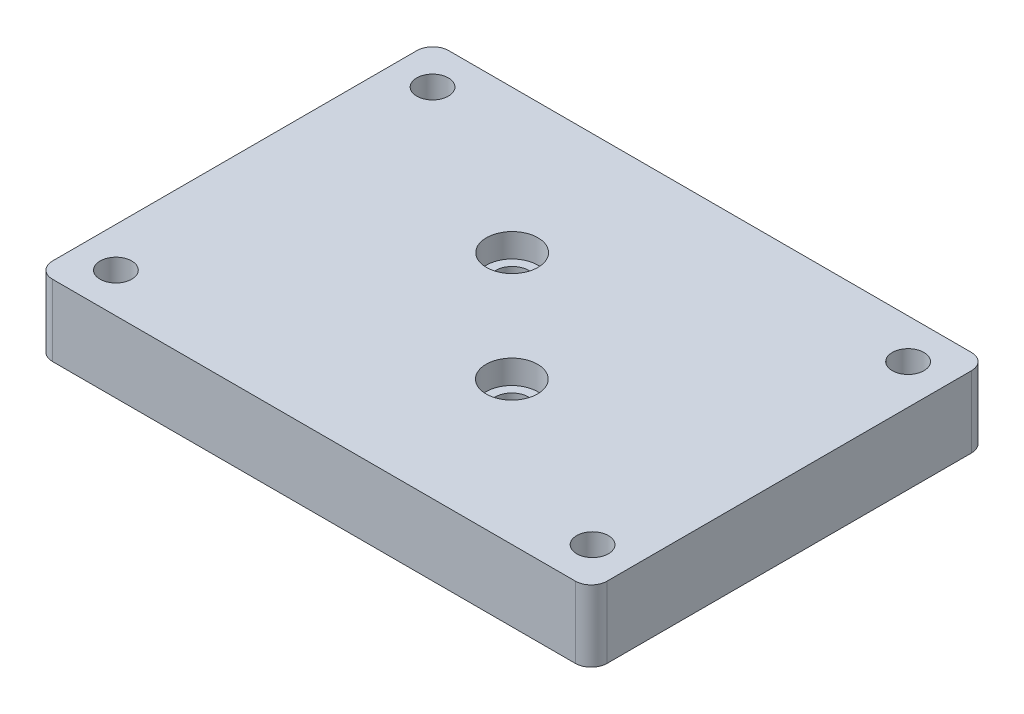
ISO-10303-21;
HEADER;
FILE_DESCRIPTION(('STEP AP214'),'2;1');
FILE_NAME('part.step','',(''),(''),'','','');
FILE_SCHEMA(('AUTOMOTIVE_DESIGN { 1 0 10303 214 1 1 1 1 }'));
ENDSEC;
DATA;
#1=APPLICATION_CONTEXT('core data for automotive mechanical design processes');
#2=APPLICATION_PROTOCOL_DEFINITION('international standard','automotive_design',2000,#1);
#3=PRODUCT_CONTEXT('',#1,'mechanical');
#4=PRODUCT('Part','Part','',(#3));
#5=PRODUCT_RELATED_PRODUCT_CATEGORY('part','',(#4));
#6=PRODUCT_DEFINITION_FORMATION('','',#4);
#7=PRODUCT_DEFINITION_CONTEXT('part definition',#1,'design');
#8=PRODUCT_DEFINITION('design','',#6,#7);
#9=PRODUCT_DEFINITION_SHAPE('','',#8);
#10=(LENGTH_UNIT() NAMED_UNIT(*) SI_UNIT(.MILLI.,.METRE.));
#11=(NAMED_UNIT(*) PLANE_ANGLE_UNIT() SI_UNIT($,.RADIAN.));
#12=(NAMED_UNIT(*) SI_UNIT($,.STERADIAN.) SOLID_ANGLE_UNIT());
#13=UNCERTAINTY_MEASURE_WITH_UNIT(LENGTH_MEASURE(1.E-05),#10,'distance_accuracy_value','');
#14=(GEOMETRIC_REPRESENTATION_CONTEXT(3) GLOBAL_UNCERTAINTY_ASSIGNED_CONTEXT((#13)) GLOBAL_UNIT_ASSIGNED_CONTEXT((#10,
#11,#12)) REPRESENTATION_CONTEXT('',''));
#15=CARTESIAN_POINT('',(0.,0.,0.));
#16=DIRECTION('',(0.,0.,1.));
#17=DIRECTION('',(1.,0.,0.));
#18=AXIS2_PLACEMENT_3D('',#15,#16,#17);
#19=CARTESIAN_POINT('',(-28.500824125447,9.,-0.102965199523085));
#20=DIRECTION('',(0.,-1.,0.));
#21=DIRECTION('',(0.,0.,-1.));
#22=AXIS2_PLACEMENT_3D('',#19,#20,#21);
#23=CYLINDRICAL_SURFACE('',#22,6.50000000000001);
#24=CARTESIAN_POINT('',(-28.500824125447,0.,-0.102965199523085));
#25=DIRECTION('',(0.,1.,0.));
#26=DIRECTION('',(0.,0.,1.));
#27=AXIS2_PLACEMENT_3D('',#24,#25,#26);
#28=CIRCLE('',#27,6.50000000000001);
#29=CARTESIAN_POINT('',(-28.500824125447,0.,6.39703480047692));
#30=VERTEX_POINT('',#29);
#31=EDGE_CURVE('E173',#30,#30,#28,.T.);
#32=ORIENTED_EDGE('',*,*,#31,.F.);
#33=EDGE_LOOP('',(#32));
#34=FACE_BOUND('',#33,.T.);
#35=CARTESIAN_POINT('',(-28.500824125447,4.5,-0.102965199523085));
#36=DIRECTION('',(0.,1.,0.));
#37=DIRECTION('',(0.,0.,1.));
#38=AXIS2_PLACEMENT_3D('',#35,#36,#37);
#39=CIRCLE('',#38,6.5);
#40=CARTESIAN_POINT('',(-28.500824125447,4.5,6.39703480047692));
#41=VERTEX_POINT('',#40);
#42=EDGE_CURVE('E209',#41,#41,#39,.T.);
#43=ORIENTED_EDGE('',*,*,#42,.T.);
#44=EDGE_LOOP('',(#43));
#45=FACE_BOUND('',#44,.T.);
#46=ADVANCED_FACE('F37',(#34,#45),#23,.F.);
#47=CARTESIAN_POINT('',(-21.595316651252,0.,6.82252153599509));
#48=DIRECTION('',(0.,1.,0.));
#49=DIRECTION('',(0.,0.,1.));
#50=AXIS2_PLACEMENT_3D('',#47,#48,#49);
#51=CYLINDRICAL_SURFACE('',#50,2.1);
#52=CARTESIAN_POINT('',(-21.595316651252,0.,6.82252153599509));
#53=DIRECTION('',(0.,1.,0.));
#54=DIRECTION('',(0.,0.,1.));
#55=AXIS2_PLACEMENT_3D('',#52,#53,#54);
#56=CIRCLE('',#55,2.1);
#57=CARTESIAN_POINT('',(-21.595316651252,0.,8.92252153599509));
#58=VERTEX_POINT('',#57);
#59=EDGE_CURVE('E199',#58,#58,#56,.T.);
#60=ORIENTED_EDGE('',*,*,#59,.F.);
#61=EDGE_LOOP('',(#60));
#62=FACE_BOUND('',#61,.T.);
#63=CARTESIAN_POINT('',(-21.595316651252,6.,6.82252153599509));
#64=DIRECTION('',(0.,1.,0.));
#65=DIRECTION('',(0.,0.,1.));
#66=AXIS2_PLACEMENT_3D('',#63,#64,#65);
#67=CIRCLE('',#66,2.1);
#68=CARTESIAN_POINT('',(-21.595316651252,6.,8.92252153599509));
#69=VERTEX_POINT('',#68);
#70=EDGE_CURVE('E137',#69,#69,#67,.F.);
#71=ORIENTED_EDGE('',*,*,#70,.F.);
#72=EDGE_LOOP('',(#71));
#73=FACE_BOUND('',#72,.T.);
#74=ADVANCED_FACE('F260',(#62,#73),#51,.F.);
#75=CARTESIAN_POINT('',(-35.4063315996419,0.,-7.02845193504126));
#76=DIRECTION('',(0.,1.,0.));
#77=DIRECTION('',(0.,0.,1.));
#78=AXIS2_PLACEMENT_3D('',#75,#76,#77);
#79=CYLINDRICAL_SURFACE('',#78,2.1);
#80=CARTESIAN_POINT('',(-35.4063315996419,0.,-7.02845193504126));
#81=DIRECTION('',(0.,1.,0.));
#82=DIRECTION('',(0.,0.,1.));
#83=AXIS2_PLACEMENT_3D('',#80,#81,#82);
#84=CIRCLE('',#83,2.1);
#85=CARTESIAN_POINT('',(-35.4063315996419,0.,-4.92845193504126));
#86=VERTEX_POINT('',#85);
#87=EDGE_CURVE('E177',#86,#86,#84,.T.);
#88=ORIENTED_EDGE('',*,*,#87,.F.);
#89=EDGE_LOOP('',(#88));
#90=FACE_BOUND('',#89,.T.);
#91=CARTESIAN_POINT('',(-35.4063315996419,6.,-7.02845193504126));
#92=DIRECTION('',(0.,1.,0.));
#93=DIRECTION('',(0.,0.,1.));
#94=AXIS2_PLACEMENT_3D('',#91,#92,#93);
#95=CIRCLE('',#94,2.1);
#96=CARTESIAN_POINT('',(-35.4063315996419,6.,-4.92845193504126));
#97=VERTEX_POINT('',#96);
#98=EDGE_CURVE('E193',#97,#97,#95,.F.);
#99=ORIENTED_EDGE('',*,*,#98,.F.);
#100=EDGE_LOOP('',(#99));
#101=FACE_BOUND('',#100,.T.);
#102=ADVANCED_FACE('F266',(#90,#101),#79,.F.);
#103=CARTESIAN_POINT('',(0.,9.,-25.1029651995231));
#104=DIRECTION('',(0.,0.,1.));
#105=DIRECTION('',(1.,0.,0.));
#106=AXIS2_PLACEMENT_3D('',#103,#104,#105);
#107=PLANE('',#106);
#108=DIRECTION('',(-1.,0.,0.));
#109=VECTOR('',#108,1.);
#110=CARTESIAN_POINT('',(0.,9.,-25.1029651995231));
#111=LINE('',#110,#109);
#112=CARTESIAN_POINT('',(4.49917587455304,9.,-25.1029651995231));
#113=VERTEX_POINT('',#112);
#114=CARTESIAN_POINT('',(-61.500824125447,9.,-25.1029651995231));
#115=VERTEX_POINT('',#114);
#116=EDGE_CURVE('E161',#113,#115,#111,.T.);
#117=ORIENTED_EDGE('',*,*,#116,.F.);
#118=DIRECTION('',(0.,-1.,0.));
#119=VECTOR('',#118,1.);
#120=CARTESIAN_POINT('',(4.49917587455304,0.,-25.1029651995231));
#121=LINE('',#120,#119);
#122=CARTESIAN_POINT('',(4.49917587455304,0.,-25.1029651995231));
#123=VERTEX_POINT('',#122);
#124=EDGE_CURVE('E156',#113,#123,#121,.T.);
#125=ORIENTED_EDGE('',*,*,#124,.T.);
#126=DIRECTION('',(-1.,0.,0.));
#127=VECTOR('',#126,1.);
#128=CARTESIAN_POINT('',(0.,0.,-25.1029651995231));
#129=LINE('',#128,#127);
#130=CARTESIAN_POINT('',(-61.500824125447,0.,-25.1029651995231));
#131=VERTEX_POINT('',#130);
#132=EDGE_CURVE('E108',#123,#131,#129,.T.);
#133=ORIENTED_EDGE('',*,*,#132,.T.);
#134=DIRECTION('',(0.,-1.,0.));
#135=VECTOR('',#134,1.);
#136=CARTESIAN_POINT('',(-61.500824125447,9.,-25.1029651995231));
#137=LINE('',#136,#135);
#138=EDGE_CURVE('E154',#131,#115,#137,.F.);
#139=ORIENTED_EDGE('',*,*,#138,.T.);
#140=EDGE_LOOP('',(#117,#125,#133,#139));
#141=FACE_BOUND('',#140,.T.);
#142=ADVANCED_FACE('F159',(#141),#107,.F.);
#143=CARTESIAN_POINT('',(-63.500824125447,9.,0.));
#144=DIRECTION('',(1.,0.,0.));
#145=DIRECTION('',(0.,0.,-1.));
#146=AXIS2_PLACEMENT_3D('',#143,#144,#145);
#147=PLANE('',#146);
#148=DIRECTION('',(0.,0.,1.));
#149=VECTOR('',#148,1.);
#150=CARTESIAN_POINT('',(-63.500824125447,9.,0.));
#151=LINE('',#150,#149);
#152=CARTESIAN_POINT('',(-63.500824125447,9.,-23.1029651995231));
#153=VERTEX_POINT('',#152);
#154=CARTESIAN_POINT('',(-63.500824125447,9.,22.8970348004769));
#155=VERTEX_POINT('',#154);
#156=EDGE_CURVE('E162',#153,#155,#151,.T.);
#157=ORIENTED_EDGE('',*,*,#156,.F.);
#158=DIRECTION('',(0.,-1.,0.));
#159=VECTOR('',#158,1.);
#160=CARTESIAN_POINT('',(-63.500824125447,9.,-23.1029651995231));
#161=LINE('',#160,#159);
#162=CARTESIAN_POINT('',(-63.500824125447,0.,-23.1029651995231));
#163=VERTEX_POINT('',#162);
#164=EDGE_CURVE('E11',#153,#163,#161,.T.);
#165=ORIENTED_EDGE('',*,*,#164,.T.);
#166=DIRECTION('',(0.,0.,1.));
#167=VECTOR('',#166,1.);
#168=CARTESIAN_POINT('',(-63.500824125447,0.,0.));
#169=LINE('',#168,#167);
#170=CARTESIAN_POINT('',(-63.500824125447,0.,22.8970348004769));
#171=VERTEX_POINT('',#170);
#172=EDGE_CURVE('E190',#163,#171,#169,.T.);
#173=ORIENTED_EDGE('',*,*,#172,.T.);
#174=DIRECTION('',(0.,-1.,0.));
#175=VECTOR('',#174,1.);
#176=CARTESIAN_POINT('',(-63.500824125447,9.,22.8970348004769));
#177=LINE('',#176,#175);
#178=EDGE_CURVE('E45',#171,#155,#177,.F.);
#179=ORIENTED_EDGE('',*,*,#178,.T.);
#180=EDGE_LOOP('',(#157,#165,#173,#179));
#181=FACE_BOUND('',#180,.T.);
#182=ADVANCED_FACE('F248',(#181),#147,.F.);
#183=CARTESIAN_POINT('',(0.,9.,24.8970348004769));
#184=DIRECTION('',(0.,0.,1.));
#185=DIRECTION('',(1.,0.,0.));
#186=AXIS2_PLACEMENT_3D('',#183,#184,#185);
#187=PLANE('',#186);
#188=DIRECTION('',(-1.,0.,0.));
#189=VECTOR('',#188,1.);
#190=CARTESIAN_POINT('',(0.,0.,24.8970348004769));
#191=LINE('',#190,#189);
#192=CARTESIAN_POINT('',(4.49917587455305,0.,24.8970348004769));
#193=VERTEX_POINT('',#192);
#194=CARTESIAN_POINT('',(-61.500824125447,0.,24.8970348004769));
#195=VERTEX_POINT('',#194);
#196=EDGE_CURVE('E125',#193,#195,#191,.T.);
#197=ORIENTED_EDGE('',*,*,#196,.F.);
#198=DIRECTION('',(0.,-1.,0.));
#199=VECTOR('',#198,1.);
#200=CARTESIAN_POINT('',(4.49917587455305,9.,24.8970348004769));
#201=LINE('',#200,#199);
#202=CARTESIAN_POINT('',(4.49917587455305,9.,24.8970348004769));
#203=VERTEX_POINT('',#202);
#204=EDGE_CURVE('E146',#193,#203,#201,.F.);
#205=ORIENTED_EDGE('',*,*,#204,.T.);
#206=DIRECTION('',(-1.,0.,0.));
#207=VECTOR('',#206,1.);
#208=CARTESIAN_POINT('',(0.,9.,24.8970348004769));
#209=LINE('',#208,#207);
#210=CARTESIAN_POINT('',(-61.500824125447,9.,24.8970348004769));
#211=VERTEX_POINT('',#210);
#212=EDGE_CURVE('E134',#203,#211,#209,.T.);
#213=ORIENTED_EDGE('',*,*,#212,.T.);
#214=DIRECTION('',(0.,-1.,0.));
#215=VECTOR('',#214,1.);
#216=CARTESIAN_POINT('',(-61.500824125447,0.,24.8970348004769));
#217=LINE('',#216,#215);
#218=EDGE_CURVE('E143',#211,#195,#217,.T.);
#219=ORIENTED_EDGE('',*,*,#218,.T.);
#220=EDGE_LOOP('',(#197,#205,#213,#219));
#221=FACE_BOUND('',#220,.T.);
#222=ADVANCED_FACE('F245',(#221),#187,.T.);
#223=CARTESIAN_POINT('',(-58.5287751823824,9.,-20.1029651995231));
#224=DIRECTION('',(0.,-1.,0.));
#225=DIRECTION('',(0.,0.,-1.));
#226=AXIS2_PLACEMENT_3D('',#223,#224,#225);
#227=CYLINDRICAL_SURFACE('',#226,2.);
#228=CARTESIAN_POINT('',(-58.5287751823824,9.,-20.1029651995231));
#229=DIRECTION('',(0.,1.,0.));
#230=DIRECTION('',(0.,0.,1.));
#231=AXIS2_PLACEMENT_3D('',#228,#229,#230);
#232=CIRCLE('',#231,2.);
#233=CARTESIAN_POINT('',(-58.5287751823824,9.,-18.1029651995231));
#234=VERTEX_POINT('',#233);
#235=EDGE_CURVE('E163',#234,#234,#232,.T.);
#236=ORIENTED_EDGE('',*,*,#235,.T.);
#237=EDGE_LOOP('',(#236));
#238=FACE_BOUND('',#237,.T.);
#239=CARTESIAN_POINT('',(-58.5287751823824,0.,-20.1029651995231));
#240=DIRECTION('',(0.,1.,0.));
#241=DIRECTION('',(0.,0.,1.));
#242=AXIS2_PLACEMENT_3D('',#239,#240,#241);
#243=CIRCLE('',#242,2.);
#244=CARTESIAN_POINT('',(-58.5287751823824,0.,-18.1029651995231));
#245=VERTEX_POINT('',#244);
#246=EDGE_CURVE('E186',#245,#245,#243,.T.);
#247=ORIENTED_EDGE('',*,*,#246,.F.);
#248=EDGE_LOOP('',(#247));
#249=FACE_BOUND('',#248,.T.);
#250=ADVANCED_FACE('F304',(#238,#249),#227,.F.);
#251=CARTESIAN_POINT('',(-58.500824125447,9.,19.8970348004769));
#252=DIRECTION('',(0.,-1.,0.));
#253=DIRECTION('',(0.,0.,-1.));
#254=AXIS2_PLACEMENT_3D('',#251,#252,#253);
#255=CYLINDRICAL_SURFACE('',#254,2.);
#256=CARTESIAN_POINT('',(-58.500824125447,9.,19.8970348004769));
#257=DIRECTION('',(0.,1.,0.));
#258=DIRECTION('',(0.,0.,1.));
#259=AXIS2_PLACEMENT_3D('',#256,#257,#258);
#260=CIRCLE('',#259,2.);
#261=CARTESIAN_POINT('',(-58.500824125447,9.,21.8970348004769));
#262=VERTEX_POINT('',#261);
#263=EDGE_CURVE('E167',#262,#262,#260,.T.);
#264=ORIENTED_EDGE('',*,*,#263,.T.);
#265=EDGE_LOOP('',(#264));
#266=FACE_BOUND('',#265,.T.);
#267=CARTESIAN_POINT('',(-58.500824125447,0.,19.8970348004769));
#268=DIRECTION('',(0.,1.,0.));
#269=DIRECTION('',(0.,0.,1.));
#270=AXIS2_PLACEMENT_3D('',#267,#268,#269);
#271=CIRCLE('',#270,2.);
#272=CARTESIAN_POINT('',(-58.500824125447,0.,21.8970348004769));
#273=VERTEX_POINT('',#272);
#274=EDGE_CURVE('E183',#273,#273,#271,.T.);
#275=ORIENTED_EDGE('',*,*,#274,.F.);
#276=EDGE_LOOP('',(#275));
#277=FACE_BOUND('',#276,.T.);
#278=ADVANCED_FACE('F227',(#266,#277),#255,.F.);
#279=CARTESIAN_POINT('',(1.60014213614768,9.,19.8302312802415));
#280=DIRECTION('',(0.,-1.,0.));
#281=DIRECTION('',(0.,0.,-1.));
#282=AXIS2_PLACEMENT_3D('',#279,#280,#281);
#283=CYLINDRICAL_SURFACE('',#282,2.);
#284=CARTESIAN_POINT('',(1.60014213614768,9.,19.8302312802415));
#285=DIRECTION('',(0.,1.,0.));
#286=DIRECTION('',(0.,0.,1.));
#287=AXIS2_PLACEMENT_3D('',#284,#285,#286);
#288=CIRCLE('',#287,2.);
#289=CARTESIAN_POINT('',(1.60014213614768,9.,21.8302312802415));
#290=VERTEX_POINT('',#289);
#291=EDGE_CURVE('E222',#290,#290,#288,.T.);
#292=ORIENTED_EDGE('',*,*,#291,.T.);
#293=EDGE_LOOP('',(#292));
#294=FACE_BOUND('',#293,.T.);
#295=CARTESIAN_POINT('',(1.60014213614768,0.,19.8302312802415));
#296=DIRECTION('',(0.,1.,0.));
#297=DIRECTION('',(0.,0.,1.));
#298=AXIS2_PLACEMENT_3D('',#295,#296,#297);
#299=CIRCLE('',#298,2.);
#300=CARTESIAN_POINT('',(1.60014213614768,0.,21.8302312802415));
#301=VERTEX_POINT('',#300);
#302=EDGE_CURVE('E180',#301,#301,#299,.T.);
#303=ORIENTED_EDGE('',*,*,#302,.F.);
#304=EDGE_LOOP('',(#303));
#305=FACE_BOUND('',#304,.T.);
#306=ADVANCED_FACE('F313',(#294,#305),#283,.F.);
#307=CARTESIAN_POINT('',(1.49917587455305,9.,-20.1029651995231));
#308=DIRECTION('',(0.,-1.,0.));
#309=DIRECTION('',(0.,0.,-1.));
#310=AXIS2_PLACEMENT_3D('',#307,#308,#309);
#311=CYLINDRICAL_SURFACE('',#310,2.);
#312=CARTESIAN_POINT('',(1.49917587455305,9.,-20.1029651995231));
#313=DIRECTION('',(0.,1.,0.));
#314=DIRECTION('',(0.,0.,1.));
#315=AXIS2_PLACEMENT_3D('',#312,#313,#314);
#316=CIRCLE('',#315,2.);
#317=CARTESIAN_POINT('',(1.49917587455305,9.,-18.1029651995231));
#318=VERTEX_POINT('',#317);
#319=EDGE_CURVE('E124',#318,#318,#316,.T.);
#320=ORIENTED_EDGE('',*,*,#319,.T.);
#321=EDGE_LOOP('',(#320));
#322=FACE_BOUND('',#321,.T.);
#323=CARTESIAN_POINT('',(1.49917587455305,0.,-20.1029651995231));
#324=DIRECTION('',(0.,1.,0.));
#325=DIRECTION('',(0.,0.,1.));
#326=AXIS2_PLACEMENT_3D('',#323,#324,#325);
#327=CIRCLE('',#326,2.);
#328=CARTESIAN_POINT('',(1.49917587455305,0.,-18.1029651995231));
#329=VERTEX_POINT('',#328);
#330=EDGE_CURVE('E176',#329,#329,#327,.T.);
#331=ORIENTED_EDGE('',*,*,#330,.F.);
#332=EDGE_LOOP('',(#331));
#333=FACE_BOUND('',#332,.T.);
#334=ADVANCED_FACE('F273',(#322,#333),#311,.F.);
#335=CARTESIAN_POINT('',(6.49917587455305,9.,0.));
#336=DIRECTION('',(1.,0.,0.));
#337=DIRECTION('',(0.,0.,-1.));
#338=AXIS2_PLACEMENT_3D('',#335,#336,#337);
#339=PLANE('',#338);
#340=DIRECTION('',(0.,0.,1.));
#341=VECTOR('',#340,1.);
#342=CARTESIAN_POINT('',(6.49917587455305,9.,0.));
#343=LINE('',#342,#341);
#344=CARTESIAN_POINT('',(6.49917587455305,9.,-23.1029651995231));
#345=VERTEX_POINT('',#344);
#346=CARTESIAN_POINT('',(6.49917587455305,9.,22.8970348004769));
#347=VERTEX_POINT('',#346);
#348=EDGE_CURVE('E130',#345,#347,#343,.T.);
#349=ORIENTED_EDGE('',*,*,#348,.T.);
#350=DIRECTION('',(0.,-1.,0.));
#351=VECTOR('',#350,1.);
#352=CARTESIAN_POINT('',(6.49917587455305,9.,22.8970348004769));
#353=LINE('',#352,#351);
#354=CARTESIAN_POINT('',(6.49917587455305,0.,22.8970348004769));
#355=VERTEX_POINT('',#354);
#356=EDGE_CURVE('E123',#347,#355,#353,.T.);
#357=ORIENTED_EDGE('',*,*,#356,.T.);
#358=DIRECTION('',(0.,0.,1.));
#359=VECTOR('',#358,1.);
#360=CARTESIAN_POINT('',(6.49917587455305,0.,0.));
#361=LINE('',#360,#359);
#362=CARTESIAN_POINT('',(6.49917587455305,0.,-23.1029651995231));
#363=VERTEX_POINT('',#362);
#364=EDGE_CURVE('E106',#363,#355,#361,.T.);
#365=ORIENTED_EDGE('',*,*,#364,.F.);
#366=DIRECTION('',(0.,-1.,0.));
#367=VECTOR('',#366,1.);
#368=CARTESIAN_POINT('',(6.49917587455305,9.,-23.1029651995231));
#369=LINE('',#368,#367);
#370=EDGE_CURVE('E120',#363,#345,#369,.F.);
#371=ORIENTED_EDGE('',*,*,#370,.T.);
#372=EDGE_LOOP('',(#349,#357,#365,#371));
#373=FACE_BOUND('',#372,.T.);
#374=ADVANCED_FACE('F119',(#373),#339,.T.);
#375=CARTESIAN_POINT('',(0.,9.,0.));
#376=DIRECTION('',(0.,1.,0.));
#377=DIRECTION('',(0.,0.,1.));
#378=AXIS2_PLACEMENT_3D('',#375,#376,#377);
#379=PLANE('',#378);
#380=CARTESIAN_POINT('',(-35.4063315996419,9.,-7.02845193504126));
#381=DIRECTION('',(0.,1.,0.));
#382=DIRECTION('',(0.,0.,1.));
#383=AXIS2_PLACEMENT_3D('',#380,#381,#382);
#384=CIRCLE('',#383,3.25);
#385=CARTESIAN_POINT('',(-35.4063315996419,9.,-3.77845193504126));
#386=VERTEX_POINT('',#385);
#387=EDGE_CURVE('E201',#386,#386,#384,.T.);
#388=ORIENTED_EDGE('',*,*,#387,.F.);
#389=EDGE_LOOP('',(#388));
#390=FACE_BOUND('',#389,.T.);
#391=CARTESIAN_POINT('',(-21.595316651252,9.,6.82252153599509));
#392=DIRECTION('',(0.,1.,0.));
#393=DIRECTION('',(0.,0.,1.));
#394=AXIS2_PLACEMENT_3D('',#391,#392,#393);
#395=CIRCLE('',#394,3.25);
#396=CARTESIAN_POINT('',(-21.595316651252,9.,10.0725215359951));
#397=VERTEX_POINT('',#396);
#398=EDGE_CURVE('E213',#397,#397,#395,.T.);
#399=ORIENTED_EDGE('',*,*,#398,.F.);
#400=EDGE_LOOP('',(#399));
#401=FACE_BOUND('',#400,.T.);
#402=ORIENTED_EDGE('',*,*,#319,.F.);
#403=EDGE_LOOP('',(#402));
#404=FACE_BOUND('',#403,.T.);
#405=ORIENTED_EDGE('',*,*,#291,.F.);
#406=EDGE_LOOP('',(#405));
#407=FACE_BOUND('',#406,.T.);
#408=ORIENTED_EDGE('',*,*,#263,.F.);
#409=EDGE_LOOP('',(#408));
#410=FACE_BOUND('',#409,.T.);
#411=ORIENTED_EDGE('',*,*,#235,.F.);
#412=EDGE_LOOP('',(#411));
#413=FACE_BOUND('',#412,.T.);
#414=ORIENTED_EDGE('',*,*,#212,.F.);
#415=CARTESIAN_POINT('',(4.49917587455305,9.,22.8970348004769));
#416=DIRECTION('',(0.,1.,0.));
#417=DIRECTION('',(0.,0.,1.));
#418=AXIS2_PLACEMENT_3D('',#415,#416,#417);
#419=CIRCLE('',#418,2.);
#420=EDGE_CURVE('E152',#203,#347,#419,.T.);
#421=ORIENTED_EDGE('',*,*,#420,.T.);
#422=ORIENTED_EDGE('',*,*,#348,.F.);
#423=CARTESIAN_POINT('',(4.49917587455304,9.,-23.1029651995231));
#424=DIRECTION('',(0.,1.,0.));
#425=DIRECTION('',(0.,0.,1.));
#426=AXIS2_PLACEMENT_3D('',#423,#424,#425);
#427=CIRCLE('',#426,2.);
#428=EDGE_CURVE('E129',#345,#113,#427,.T.);
#429=ORIENTED_EDGE('',*,*,#428,.T.);
#430=ORIENTED_EDGE('',*,*,#116,.T.);
#431=CARTESIAN_POINT('',(-61.500824125447,9.,-23.1029651995231));
#432=DIRECTION('',(0.,1.,0.));
#433=DIRECTION('',(0.,0.,1.));
#434=AXIS2_PLACEMENT_3D('',#431,#432,#433);
#435=CIRCLE('',#434,2.);
#436=EDGE_CURVE('E58',#115,#153,#435,.T.);
#437=ORIENTED_EDGE('',*,*,#436,.T.);
#438=ORIENTED_EDGE('',*,*,#156,.T.);
#439=CARTESIAN_POINT('',(-61.500824125447,9.,22.8970348004769));
#440=DIRECTION('',(0.,1.,0.));
#441=DIRECTION('',(0.,0.,1.));
#442=AXIS2_PLACEMENT_3D('',#439,#440,#441);
#443=CIRCLE('',#442,2.);
#444=EDGE_CURVE('E148',#155,#211,#443,.T.);
#445=ORIENTED_EDGE('',*,*,#444,.T.);
#446=EDGE_LOOP('',(#414,#421,#422,#429,#430,#437,#438,#445));
#447=FACE_BOUND('',#446,.T.);
#448=ADVANCED_FACE('F230',(#390,#401,#404,#407,#410,#413,#447),#379,.T.);
#449=CARTESIAN_POINT('',(0.,0.,0.));
#450=DIRECTION('',(0.,1.,0.));
#451=DIRECTION('',(0.,0.,1.));
#452=AXIS2_PLACEMENT_3D('',#449,#450,#451);
#453=PLANE('',#452);
#454=ORIENTED_EDGE('',*,*,#87,.T.);
#455=EDGE_LOOP('',(#454));
#456=FACE_BOUND('',#455,.T.);
#457=ORIENTED_EDGE('',*,*,#59,.T.);
#458=EDGE_LOOP('',(#457));
#459=FACE_BOUND('',#458,.T.);
#460=ORIENTED_EDGE('',*,*,#31,.T.);
#461=EDGE_LOOP('',(#460));
#462=FACE_BOUND('',#461,.T.);
#463=ORIENTED_EDGE('',*,*,#330,.T.);
#464=EDGE_LOOP('',(#463));
#465=FACE_BOUND('',#464,.T.);
#466=ORIENTED_EDGE('',*,*,#302,.T.);
#467=EDGE_LOOP('',(#466));
#468=FACE_BOUND('',#467,.T.);
#469=ORIENTED_EDGE('',*,*,#274,.T.);
#470=EDGE_LOOP('',(#469));
#471=FACE_BOUND('',#470,.T.);
#472=ORIENTED_EDGE('',*,*,#246,.T.);
#473=EDGE_LOOP('',(#472));
#474=FACE_BOUND('',#473,.T.);
#475=ORIENTED_EDGE('',*,*,#364,.T.);
#476=CARTESIAN_POINT('',(4.49917587455305,0.,22.8970348004769));
#477=DIRECTION('',(0.,1.,0.));
#478=DIRECTION('',(0.,0.,1.));
#479=AXIS2_PLACEMENT_3D('',#476,#477,#478);
#480=CIRCLE('',#479,2.);
#481=EDGE_CURVE('E113',#355,#193,#480,.F.);
#482=ORIENTED_EDGE('',*,*,#481,.T.);
#483=ORIENTED_EDGE('',*,*,#196,.T.);
#484=CARTESIAN_POINT('',(-61.500824125447,0.,22.8970348004769));
#485=DIRECTION('',(0.,1.,0.));
#486=DIRECTION('',(0.,0.,1.));
#487=AXIS2_PLACEMENT_3D('',#484,#485,#486);
#488=CIRCLE('',#487,2.);
#489=EDGE_CURVE('E132',#195,#171,#488,.F.);
#490=ORIENTED_EDGE('',*,*,#489,.T.);
#491=ORIENTED_EDGE('',*,*,#172,.F.);
#492=CARTESIAN_POINT('',(-61.500824125447,0.,-23.1029651995231));
#493=DIRECTION('',(0.,1.,0.));
#494=DIRECTION('',(0.,0.,1.));
#495=AXIS2_PLACEMENT_3D('',#492,#493,#494);
#496=CIRCLE('',#495,2.);
#497=EDGE_CURVE('E114',#163,#131,#496,.F.);
#498=ORIENTED_EDGE('',*,*,#497,.T.);
#499=ORIENTED_EDGE('',*,*,#132,.F.);
#500=CARTESIAN_POINT('',(4.49917587455304,0.,-23.1029651995231));
#501=DIRECTION('',(0.,1.,0.));
#502=DIRECTION('',(0.,0.,1.));
#503=AXIS2_PLACEMENT_3D('',#500,#501,#502);
#504=CIRCLE('',#503,2.);
#505=EDGE_CURVE('E103',#123,#363,#504,.F.);
#506=ORIENTED_EDGE('',*,*,#505,.T.);
#507=EDGE_LOOP('',(#475,#482,#483,#490,#491,#498,#499,#506));
#508=FACE_BOUND('',#507,.T.);
#509=ADVANCED_FACE('F105',(#456,#459,#462,#465,#468,#471,#474,#508),#453,.F.);
#510=CARTESIAN_POINT('',(-35.4063315996419,6.,-7.02845193504126));
#511=DIRECTION('',(0.,1.,0.));
#512=DIRECTION('',(0.,0.,1.));
#513=AXIS2_PLACEMENT_3D('',#510,#511,#512);
#514=PLANE('',#513);
#515=CARTESIAN_POINT('',(-35.4063315996419,6.,-7.02845193504126));
#516=DIRECTION('',(0.,1.,0.));
#517=DIRECTION('',(0.,0.,1.));
#518=AXIS2_PLACEMENT_3D('',#515,#516,#517);
#519=CIRCLE('',#518,3.25);
#520=CARTESIAN_POINT('',(-35.4063315996419,6.,-3.77845193504126));
#521=VERTEX_POINT('',#520);
#522=EDGE_CURVE('E195',#521,#521,#519,.T.);
#523=ORIENTED_EDGE('',*,*,#522,.T.);
#524=EDGE_LOOP('',(#523));
#525=FACE_BOUND('',#524,.T.);
#526=ORIENTED_EDGE('',*,*,#98,.T.);
#527=EDGE_LOOP('',(#526));
#528=FACE_BOUND('',#527,.T.);
#529=ADVANCED_FACE('F298',(#525,#528),#514,.T.);
#530=CARTESIAN_POINT('',(-35.4063315996419,6.,-7.02845193504126));
#531=DIRECTION('',(0.,1.,0.));
#532=DIRECTION('',(0.,0.,1.));
#533=AXIS2_PLACEMENT_3D('',#530,#531,#532);
#534=CYLINDRICAL_SURFACE('',#533,3.25);
#535=ORIENTED_EDGE('',*,*,#522,.F.);
#536=EDGE_LOOP('',(#535));
#537=FACE_BOUND('',#536,.T.);
#538=ORIENTED_EDGE('',*,*,#387,.T.);
#539=EDGE_LOOP('',(#538));
#540=FACE_BOUND('',#539,.T.);
#541=ADVANCED_FACE('F286',(#537,#540),#534,.F.);
#542=CARTESIAN_POINT('',(-21.595316651252,6.,6.82252153599509));
#543=DIRECTION('',(0.,1.,0.));
#544=DIRECTION('',(0.,0.,1.));
#545=AXIS2_PLACEMENT_3D('',#542,#543,#544);
#546=PLANE('',#545);
#547=CARTESIAN_POINT('',(-21.595316651252,6.,6.82252153599509));
#548=DIRECTION('',(0.,1.,0.));
#549=DIRECTION('',(0.,0.,1.));
#550=AXIS2_PLACEMENT_3D('',#547,#548,#549);
#551=CIRCLE('',#550,3.25);
#552=CARTESIAN_POINT('',(-21.595316651252,6.,10.0725215359951));
#553=VERTEX_POINT('',#552);
#554=EDGE_CURVE('E206',#553,#553,#551,.T.);
#555=ORIENTED_EDGE('',*,*,#554,.T.);
#556=EDGE_LOOP('',(#555));
#557=FACE_BOUND('',#556,.T.);
#558=ORIENTED_EDGE('',*,*,#70,.T.);
#559=EDGE_LOOP('',(#558));
#560=FACE_BOUND('',#559,.T.);
#561=ADVANCED_FACE('F280',(#557,#560),#546,.T.);
#562=CARTESIAN_POINT('',(-21.595316651252,6.,6.82252153599509));
#563=DIRECTION('',(0.,1.,0.));
#564=DIRECTION('',(0.,0.,1.));
#565=AXIS2_PLACEMENT_3D('',#562,#563,#564);
#566=CYLINDRICAL_SURFACE('',#565,3.25);
#567=ORIENTED_EDGE('',*,*,#554,.F.);
#568=EDGE_LOOP('',(#567));
#569=FACE_BOUND('',#568,.T.);
#570=ORIENTED_EDGE('',*,*,#398,.T.);
#571=EDGE_LOOP('',(#570));
#572=FACE_BOUND('',#571,.T.);
#573=ADVANCED_FACE('F276',(#569,#572),#566,.F.);
#574=CARTESIAN_POINT('',(4.49917587455305,9.,22.8970348004769));
#575=DIRECTION('',(0.,-1.,0.));
#576=DIRECTION('',(0.,0.,-1.));
#577=AXIS2_PLACEMENT_3D('',#574,#575,#576);
#578=CYLINDRICAL_SURFACE('',#577,2.);
#579=ORIENTED_EDGE('',*,*,#420,.F.);
#580=ORIENTED_EDGE('',*,*,#204,.F.);
#581=ORIENTED_EDGE('',*,*,#481,.F.);
#582=ORIENTED_EDGE('',*,*,#356,.F.);
#583=EDGE_LOOP('',(#579,#580,#581,#582));
#584=FACE_BOUND('',#583,.T.);
#585=ADVANCED_FACE('F243',(#584),#578,.T.);
#586=CARTESIAN_POINT('',(4.49917587455304,9.,-23.1029651995231));
#587=DIRECTION('',(0.,1.,0.));
#588=DIRECTION('',(0.,0.,1.));
#589=AXIS2_PLACEMENT_3D('',#586,#587,#588);
#590=CYLINDRICAL_SURFACE('',#589,2.);
#591=ORIENTED_EDGE('',*,*,#428,.F.);
#592=ORIENTED_EDGE('',*,*,#370,.F.);
#593=ORIENTED_EDGE('',*,*,#505,.F.);
#594=ORIENTED_EDGE('',*,*,#124,.F.);
#595=EDGE_LOOP('',(#591,#592,#593,#594));
#596=FACE_BOUND('',#595,.T.);
#597=ADVANCED_FACE('F128',(#596),#590,.T.);
#598=CARTESIAN_POINT('',(-61.500824125447,9.,-23.1029651995231));
#599=DIRECTION('',(0.,-1.,0.));
#600=DIRECTION('',(0.,0.,-1.));
#601=AXIS2_PLACEMENT_3D('',#598,#599,#600);
#602=CYLINDRICAL_SURFACE('',#601,2.);
#603=ORIENTED_EDGE('',*,*,#436,.F.);
#604=ORIENTED_EDGE('',*,*,#138,.F.);
#605=ORIENTED_EDGE('',*,*,#497,.F.);
#606=ORIENTED_EDGE('',*,*,#164,.F.);
#607=EDGE_LOOP('',(#603,#604,#605,#606));
#608=FACE_BOUND('',#607,.T.);
#609=ADVANCED_FACE('F251',(#608),#602,.T.);
#610=CARTESIAN_POINT('',(-61.500824125447,9.,22.8970348004769));
#611=DIRECTION('',(0.,1.,0.));
#612=DIRECTION('',(0.,0.,1.));
#613=AXIS2_PLACEMENT_3D('',#610,#611,#612);
#614=CYLINDRICAL_SURFACE('',#613,2.);
#615=ORIENTED_EDGE('',*,*,#444,.F.);
#616=ORIENTED_EDGE('',*,*,#178,.F.);
#617=ORIENTED_EDGE('',*,*,#489,.F.);
#618=ORIENTED_EDGE('',*,*,#218,.F.);
#619=EDGE_LOOP('',(#615,#616,#617,#618));
#620=FACE_BOUND('',#619,.T.);
#621=ADVANCED_FACE('F39',(#620),#614,.T.);
#622=CARTESIAN_POINT('',(-28.500824125447,4.5,-0.102965199523085));
#623=DIRECTION('',(0.,1.,0.));
#624=DIRECTION('',(0.,0.,1.));
#625=AXIS2_PLACEMENT_3D('',#622,#623,#624);
#626=PLANE('',#625);
#627=ORIENTED_EDGE('',*,*,#42,.F.);
#628=EDGE_LOOP('',(#627));
#629=FACE_BOUND('',#628,.T.);
#630=ADVANCED_FACE('F257',(#629),#626,.F.);
#631=CLOSED_SHELL('',(#46,#74,#102,#142,#182,#222,#250,#278,#306,#334,#374,#448,#509,#529,#541,
#561,#573,#585,#597,#609,#621,#630));
#632=MANIFOLD_SOLID_BREP('B2',#631);
#633=ADVANCED_BREP_SHAPE_REPRESENTATION('',(#18,#632),#14);
#634=SHAPE_DEFINITION_REPRESENTATION(#9,#633);
ENDSEC;
END-ISO-10303-21;
